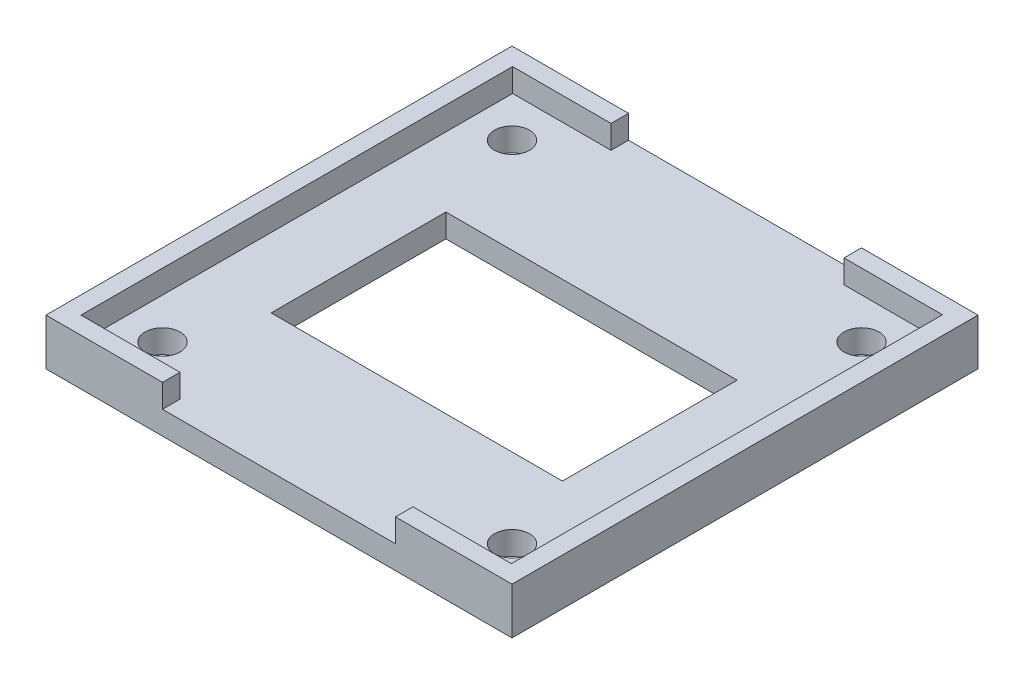
ISO-10303-21;
HEADER;
FILE_DESCRIPTION(('STEP AP214'),'2;1');
FILE_NAME('part.step','',(''),(''),'','','');
FILE_SCHEMA(('AUTOMOTIVE_DESIGN { 1 0 10303 214 1 1 1 1 }'));
ENDSEC;
DATA;
#1=APPLICATION_CONTEXT('core data for automotive mechanical design processes');
#2=APPLICATION_PROTOCOL_DEFINITION('international standard','automotive_design',2000,#1);
#3=PRODUCT_CONTEXT('',#1,'mechanical');
#4=PRODUCT('Part','Part','',(#3));
#5=PRODUCT_RELATED_PRODUCT_CATEGORY('part','',(#4));
#6=PRODUCT_DEFINITION_FORMATION('','',#4);
#7=PRODUCT_DEFINITION_CONTEXT('part definition',#1,'design');
#8=PRODUCT_DEFINITION('design','',#6,#7);
#9=PRODUCT_DEFINITION_SHAPE('','',#8);
#10=(LENGTH_UNIT() NAMED_UNIT(*) SI_UNIT(.MILLI.,.METRE.));
#11=(NAMED_UNIT(*) PLANE_ANGLE_UNIT() SI_UNIT($,.RADIAN.));
#12=(NAMED_UNIT(*) SI_UNIT($,.STERADIAN.) SOLID_ANGLE_UNIT());
#13=UNCERTAINTY_MEASURE_WITH_UNIT(LENGTH_MEASURE(1.E-05),#10,'distance_accuracy_value','');
#14=(GEOMETRIC_REPRESENTATION_CONTEXT(3) GLOBAL_UNCERTAINTY_ASSIGNED_CONTEXT((#13)) GLOBAL_UNIT_ASSIGNED_CONTEXT((#10,
#11,#12)) REPRESENTATION_CONTEXT('',''));
#15=CARTESIAN_POINT('',(0.,0.,0.));
#16=DIRECTION('',(0.,0.,1.));
#17=DIRECTION('',(1.,0.,0.));
#18=AXIS2_PLACEMENT_3D('',#15,#16,#17);
#19=CARTESIAN_POINT('',(0.,2.,0.));
#20=DIRECTION('',(0.,1.,0.));
#21=DIRECTION('',(0.,0.,1.));
#22=AXIS2_PLACEMENT_3D('',#19,#20,#21);
#23=PLANE('',#22);
#24=DIRECTION('',(0.,0.,1.));
#25=VECTOR('',#24,1.);
#26=CARTESIAN_POINT('',(12.5,2.,7.5));
#27=LINE('',#26,#25);
#28=CARTESIAN_POINT('',(12.5,2.,-7.5));
#29=VERTEX_POINT('',#28);
#30=CARTESIAN_POINT('',(12.5,2.,7.5));
#31=VERTEX_POINT('',#30);
#32=EDGE_CURVE('E172',#29,#31,#27,.T.);
#33=ORIENTED_EDGE('',*,*,#32,.T.);
#34=DIRECTION('',(-1.,0.,0.));
#35=VECTOR('',#34,1.);
#36=CARTESIAN_POINT('',(-12.5,2.,7.5));
#37=LINE('',#36,#35);
#38=CARTESIAN_POINT('',(-12.5,2.,7.5));
#39=VERTEX_POINT('',#38);
#40=EDGE_CURVE('E181',#31,#39,#37,.T.);
#41=ORIENTED_EDGE('',*,*,#40,.T.);
#42=DIRECTION('',(0.,0.,-1.));
#43=VECTOR('',#42,1.);
#44=CARTESIAN_POINT('',(-12.5,2.,7.5));
#45=LINE('',#44,#43);
#46=CARTESIAN_POINT('',(-12.5,2.,-7.5));
#47=VERTEX_POINT('',#46);
#48=EDGE_CURVE('E48',#39,#47,#45,.T.);
#49=ORIENTED_EDGE('',*,*,#48,.T.);
#50=DIRECTION('',(1.,0.,0.));
#51=VECTOR('',#50,1.);
#52=CARTESIAN_POINT('',(-12.5,2.,-7.5));
#53=LINE('',#52,#51);
#54=EDGE_CURVE('E178',#47,#29,#53,.T.);
#55=ORIENTED_EDGE('',*,*,#54,.T.);
#56=EDGE_LOOP('',(#33,#41,#49,#55));
#57=FACE_BOUND('',#56,.T.);
#58=CARTESIAN_POINT('',(15.,2.,14.3258426966292));
#59=DIRECTION('',(0.,1.,0.));
#60=DIRECTION('',(0.,0.,-1.));
#61=AXIS2_PLACEMENT_3D('',#58,#59,#60);
#62=CIRCLE('',#61,1.5);
#63=CARTESIAN_POINT('',(15.,2.,12.8258426966292));
#64=VERTEX_POINT('',#63);
#65=EDGE_CURVE('E316',#64,#64,#62,.T.);
#66=ORIENTED_EDGE('',*,*,#65,.F.);
#67=EDGE_LOOP('',(#66));
#68=FACE_BOUND('',#67,.T.);
#69=CARTESIAN_POINT('',(-15.,2.,-15.6741573033708));
#70=DIRECTION('',(0.,1.,0.));
#71=DIRECTION('',(0.,0.,1.));
#72=AXIS2_PLACEMENT_3D('',#69,#70,#71);
#73=CIRCLE('',#72,1.5);
#74=CARTESIAN_POINT('',(-15.,2.,-14.1741573033708));
#75=VERTEX_POINT('',#74);
#76=EDGE_CURVE('E328',#75,#75,#73,.T.);
#77=ORIENTED_EDGE('',*,*,#76,.F.);
#78=EDGE_LOOP('',(#77));
#79=FACE_BOUND('',#78,.T.);
#80=CARTESIAN_POINT('',(15.,2.,-15.6741573033708));
#81=DIRECTION('',(0.,1.,0.));
#82=DIRECTION('',(0.,0.,1.));
#83=AXIS2_PLACEMENT_3D('',#80,#81,#82);
#84=CIRCLE('',#83,1.5);
#85=CARTESIAN_POINT('',(15.,2.,-14.1741573033708));
#86=VERTEX_POINT('',#85);
#87=EDGE_CURVE('E322',#86,#86,#84,.T.);
#88=ORIENTED_EDGE('',*,*,#87,.F.);
#89=EDGE_LOOP('',(#88));
#90=FACE_BOUND('',#89,.T.);
#91=CARTESIAN_POINT('',(-15.,2.,14.3258426966292));
#92=DIRECTION('',(0.,1.,0.));
#93=DIRECTION('',(0.,0.,-1.));
#94=AXIS2_PLACEMENT_3D('',#91,#92,#93);
#95=CIRCLE('',#94,1.5);
#96=CARTESIAN_POINT('',(-15.,2.,12.8258426966292));
#97=VERTEX_POINT('',#96);
#98=EDGE_CURVE('E310',#97,#97,#95,.T.);
#99=ORIENTED_EDGE('',*,*,#98,.F.);
#100=EDGE_LOOP('',(#99));
#101=FACE_BOUND('',#100,.T.);
#102=DIRECTION('',(1.,0.,0.));
#103=VECTOR('',#102,1.);
#104=CARTESIAN_POINT('',(-20.,2.,19.3258426966292));
#105=LINE('',#104,#103);
#106=CARTESIAN_POINT('',(-10.0000000000003,2.,19.3258426966292));
#107=VERTEX_POINT('',#106);
#108=CARTESIAN_POINT('',(10.0000000000002,2.,19.3258426966292));
#109=VERTEX_POINT('',#108);
#110=EDGE_CURVE('E336',#107,#109,#105,.T.);
#111=ORIENTED_EDGE('',*,*,#110,.T.);
#112=DIRECTION('',(0.,0.,1.));
#113=VECTOR('',#112,1.);
#114=CARTESIAN_POINT('',(10.0000000000002,2.,19.3258426966292));
#115=LINE('',#114,#113);
#116=CARTESIAN_POINT('',(10.0000000000003,2.,17.8258426966292));
#117=VERTEX_POINT('',#116);
#118=EDGE_CURVE('E232',#117,#109,#115,.T.);
#119=ORIENTED_EDGE('',*,*,#118,.F.);
#120=DIRECTION('',(-1.,0.,0.));
#121=VECTOR('',#120,1.);
#122=CARTESIAN_POINT('',(10.0000000000003,2.,17.8258426966292));
#123=LINE('',#122,#121);
#124=CARTESIAN_POINT('',(18.4476744186047,2.,17.8258426966292));
#125=VERTEX_POINT('',#124);
#126=EDGE_CURVE('E229',#125,#117,#123,.T.);
#127=ORIENTED_EDGE('',*,*,#126,.F.);
#128=DIRECTION('',(0.,0.,1.));
#129=VECTOR('',#128,1.);
#130=CARTESIAN_POINT('',(18.4476744186047,2.,17.8258426966292));
#131=LINE('',#130,#129);
#132=CARTESIAN_POINT('',(18.4476744186047,2.,-19.1741573033708));
#133=VERTEX_POINT('',#132);
#134=EDGE_CURVE('E202',#133,#125,#131,.T.);
#135=ORIENTED_EDGE('',*,*,#134,.F.);
#136=DIRECTION('',(1.,0.,0.));
#137=VECTOR('',#136,1.);
#138=CARTESIAN_POINT('',(18.4476744186047,2.,-19.1741573033708));
#139=LINE('',#138,#137);
#140=CARTESIAN_POINT('',(10.0000000000002,2.,-19.1741573033708));
#141=VERTEX_POINT('',#140);
#142=EDGE_CURVE('E210',#141,#133,#139,.T.);
#143=ORIENTED_EDGE('',*,*,#142,.F.);
#144=DIRECTION('',(0.,0.,1.));
#145=VECTOR('',#144,1.);
#146=CARTESIAN_POINT('',(10.0000000000002,2.,-19.1741573033708));
#147=LINE('',#146,#145);
#148=CARTESIAN_POINT('',(10.0000000000002,2.,-20.6741573033708));
#149=VERTEX_POINT('',#148);
#150=EDGE_CURVE('E235',#149,#141,#147,.T.);
#151=ORIENTED_EDGE('',*,*,#150,.F.);
#152=DIRECTION('',(-1.,0.,0.));
#153=VECTOR('',#152,1.);
#154=CARTESIAN_POINT('',(-20.,2.,-20.6741573033708));
#155=LINE('',#154,#153);
#156=CARTESIAN_POINT('',(-10.0000000000002,2.,-20.6741573033708));
#157=VERTEX_POINT('',#156);
#158=EDGE_CURVE('E334',#149,#157,#155,.T.);
#159=ORIENTED_EDGE('',*,*,#158,.T.);
#160=DIRECTION('',(0.,0.,-1.));
#161=VECTOR('',#160,1.);
#162=CARTESIAN_POINT('',(-10.0000000000002,2.,-19.1741573033708));
#163=LINE('',#162,#161);
#164=CARTESIAN_POINT('',(-10.0000000000002,2.,-19.1741573033708));
#165=VERTEX_POINT('',#164);
#166=EDGE_CURVE('E281',#165,#157,#163,.T.);
#167=ORIENTED_EDGE('',*,*,#166,.F.);
#168=DIRECTION('',(1.,0.,0.));
#169=VECTOR('',#168,1.);
#170=CARTESIAN_POINT('',(-18.4476744186047,2.,-19.1741573033708));
#171=LINE('',#170,#169);
#172=CARTESIAN_POINT('',(-18.4476744186047,2.,-19.1741573033708));
#173=VERTEX_POINT('',#172);
#174=EDGE_CURVE('E257',#173,#165,#171,.T.);
#175=ORIENTED_EDGE('',*,*,#174,.F.);
#176=DIRECTION('',(0.00140803916500905,0.,-0.999999008712364));
#177=VECTOR('',#176,1.);
#178=CARTESIAN_POINT('',(-18.4476744186047,2.,-19.1741573033708));
#179=LINE('',#178,#177);
#180=CARTESIAN_POINT('',(-18.4997719193536,2.,17.8258426966292));
#181=VERTEX_POINT('',#180);
#182=EDGE_CURVE('E262',#181,#173,#179,.T.);
#183=ORIENTED_EDGE('',*,*,#182,.F.);
#184=DIRECTION('',(-1.,0.,0.));
#185=VECTOR('',#184,1.);
#186=CARTESIAN_POINT('',(-18.4997719193536,2.,17.8258426966292));
#187=LINE('',#186,#185);
#188=CARTESIAN_POINT('',(-10.0000000000003,2.,17.8258426966292));
#189=VERTEX_POINT('',#188);
#190=EDGE_CURVE('E287',#189,#181,#187,.T.);
#191=ORIENTED_EDGE('',*,*,#190,.F.);
#192=DIRECTION('',(0.,0.,-1.));
#193=VECTOR('',#192,1.);
#194=CARTESIAN_POINT('',(-10.0000000000002,2.,19.3258426966292));
#195=LINE('',#194,#193);
#196=EDGE_CURVE('E284',#107,#189,#195,.T.);
#197=ORIENTED_EDGE('',*,*,#196,.F.);
#198=EDGE_LOOP('',(#111,#119,#127,#135,#143,#151,#159,#167,#175,#183,#191,#197));
#199=FACE_BOUND('',#198,.T.);
#200=ADVANCED_FACE('F33',(#57,#68,#79,#90,#101,#199),#23,.T.);
#201=CARTESIAN_POINT('',(0.,0.,0.));
#202=DIRECTION('',(0.,1.,0.));
#203=DIRECTION('',(0.,0.,1.));
#204=AXIS2_PLACEMENT_3D('',#201,#202,#203);
#205=PLANE('',#204);
#206=DIRECTION('',(-1.,0.,0.));
#207=VECTOR('',#206,1.);
#208=CARTESIAN_POINT('',(-12.5,0.,7.5));
#209=LINE('',#208,#207);
#210=CARTESIAN_POINT('',(12.5,0.,7.5));
#211=VERTEX_POINT('',#210);
#212=CARTESIAN_POINT('',(-12.5,0.,7.5));
#213=VERTEX_POINT('',#212);
#214=EDGE_CURVE('E196',#211,#213,#209,.T.);
#215=ORIENTED_EDGE('',*,*,#214,.F.);
#216=DIRECTION('',(0.,0.,1.));
#217=VECTOR('',#216,1.);
#218=CARTESIAN_POINT('',(12.5,0.,7.5));
#219=LINE('',#218,#217);
#220=CARTESIAN_POINT('',(12.5,0.,-7.5));
#221=VERTEX_POINT('',#220);
#222=EDGE_CURVE('E56',#221,#211,#219,.T.);
#223=ORIENTED_EDGE('',*,*,#222,.F.);
#224=DIRECTION('',(1.,0.,0.));
#225=VECTOR('',#224,1.);
#226=CARTESIAN_POINT('',(-12.5,0.,-7.5));
#227=LINE('',#226,#225);
#228=CARTESIAN_POINT('',(-12.5,0.,-7.5));
#229=VERTEX_POINT('',#228);
#230=EDGE_CURVE('E187',#229,#221,#227,.T.);
#231=ORIENTED_EDGE('',*,*,#230,.F.);
#232=DIRECTION('',(0.,0.,-1.));
#233=VECTOR('',#232,1.);
#234=CARTESIAN_POINT('',(-12.5,0.,7.5));
#235=LINE('',#234,#233);
#236=EDGE_CURVE('E190',#213,#229,#235,.T.);
#237=ORIENTED_EDGE('',*,*,#236,.F.);
#238=EDGE_LOOP('',(#215,#223,#231,#237));
#239=FACE_BOUND('',#238,.T.);
#240=DIRECTION('',(0.,0.,-1.));
#241=VECTOR('',#240,1.);
#242=CARTESIAN_POINT('',(20.,0.,-20.6741573033708));
#243=LINE('',#242,#241);
#244=CARTESIAN_POINT('',(20.,0.,19.3258426966292));
#245=VERTEX_POINT('',#244);
#246=CARTESIAN_POINT('',(20.,0.,-20.6741573033708));
#247=VERTEX_POINT('',#246);
#248=EDGE_CURVE('E331',#245,#247,#243,.T.);
#249=ORIENTED_EDGE('',*,*,#248,.F.);
#250=DIRECTION('',(1.,0.,0.));
#251=VECTOR('',#250,1.);
#252=CARTESIAN_POINT('',(-20.,0.,19.3258426966292));
#253=LINE('',#252,#251);
#254=CARTESIAN_POINT('',(-20.,0.,19.3258426966292));
#255=VERTEX_POINT('',#254);
#256=EDGE_CURVE('E337',#255,#245,#253,.T.);
#257=ORIENTED_EDGE('',*,*,#256,.F.);
#258=DIRECTION('',(0.,0.,1.));
#259=VECTOR('',#258,1.);
#260=CARTESIAN_POINT('',(-20.,0.,-20.6741573033708));
#261=LINE('',#260,#259);
#262=CARTESIAN_POINT('',(-20.,0.,-20.6741573033708));
#263=VERTEX_POINT('',#262);
#264=EDGE_CURVE('E344',#263,#255,#261,.T.);
#265=ORIENTED_EDGE('',*,*,#264,.F.);
#266=DIRECTION('',(-1.,0.,0.));
#267=VECTOR('',#266,1.);
#268=CARTESIAN_POINT('',(-20.,0.,-20.6741573033708));
#269=LINE('',#268,#267);
#270=EDGE_CURVE('E342',#247,#263,#269,.T.);
#271=ORIENTED_EDGE('',*,*,#270,.F.);
#272=EDGE_LOOP('',(#249,#257,#265,#271));
#273=FACE_BOUND('',#272,.T.);
#274=CARTESIAN_POINT('',(-15.,0.,-15.6741573033708));
#275=DIRECTION('',(0.,1.,0.));
#276=DIRECTION('',(0.,0.,1.));
#277=AXIS2_PLACEMENT_3D('',#274,#275,#276);
#278=CIRCLE('',#277,1.5);
#279=CARTESIAN_POINT('',(-15.,0.,-14.1741573033708));
#280=VERTEX_POINT('',#279);
#281=EDGE_CURVE('E325',#280,#280,#278,.T.);
#282=ORIENTED_EDGE('',*,*,#281,.T.);
#283=EDGE_LOOP('',(#282));
#284=FACE_BOUND('',#283,.T.);
#285=CARTESIAN_POINT('',(15.,0.,-15.6741573033708));
#286=DIRECTION('',(0.,1.,0.));
#287=DIRECTION('',(0.,0.,1.));
#288=AXIS2_PLACEMENT_3D('',#285,#286,#287);
#289=CIRCLE('',#288,1.5);
#290=CARTESIAN_POINT('',(15.,0.,-14.1741573033708));
#291=VERTEX_POINT('',#290);
#292=EDGE_CURVE('E319',#291,#291,#289,.T.);
#293=ORIENTED_EDGE('',*,*,#292,.T.);
#294=EDGE_LOOP('',(#293));
#295=FACE_BOUND('',#294,.T.);
#296=CARTESIAN_POINT('',(15.,0.,14.3258426966292));
#297=DIRECTION('',(0.,1.,0.));
#298=DIRECTION('',(0.,0.,-1.));
#299=AXIS2_PLACEMENT_3D('',#296,#297,#298);
#300=CIRCLE('',#299,1.5);
#301=CARTESIAN_POINT('',(15.,0.,12.8258426966292));
#302=VERTEX_POINT('',#301);
#303=EDGE_CURVE('E313',#302,#302,#300,.T.);
#304=ORIENTED_EDGE('',*,*,#303,.T.);
#305=EDGE_LOOP('',(#304));
#306=FACE_BOUND('',#305,.T.);
#307=CARTESIAN_POINT('',(-15.,0.,14.3258426966292));
#308=DIRECTION('',(0.,1.,0.));
#309=DIRECTION('',(0.,0.,-1.));
#310=AXIS2_PLACEMENT_3D('',#307,#308,#309);
#311=CIRCLE('',#310,1.5);
#312=CARTESIAN_POINT('',(-15.,0.,12.8258426966292));
#313=VERTEX_POINT('',#312);
#314=EDGE_CURVE('E309',#313,#313,#311,.T.);
#315=ORIENTED_EDGE('',*,*,#314,.T.);
#316=EDGE_LOOP('',(#315));
#317=FACE_BOUND('',#316,.T.);
#318=ADVANCED_FACE('F361',(#239,#273,#284,#295,#306,#317),#205,.F.);
#319=CARTESIAN_POINT('',(20.,2.,-20.6741573033708));
#320=DIRECTION('',(-1.,0.,0.));
#321=DIRECTION('',(0.,0.,1.));
#322=AXIS2_PLACEMENT_3D('',#319,#320,#321);
#323=PLANE('',#322);
#324=ORIENTED_EDGE('',*,*,#248,.T.);
#325=DIRECTION('',(0.,-1.,0.));
#326=VECTOR('',#325,1.);
#327=CARTESIAN_POINT('',(20.,2.,-20.6741573033708));
#328=LINE('',#327,#326);
#329=CARTESIAN_POINT('',(20.,4.,-20.6741573033708));
#330=VERTEX_POINT('',#329);
#331=EDGE_CURVE('E11',#330,#247,#328,.T.);
#332=ORIENTED_EDGE('',*,*,#331,.F.);
#333=DIRECTION('',(0.,0.,-1.));
#334=VECTOR('',#333,1.);
#335=CARTESIAN_POINT('',(20.,4.,-20.6741573033708));
#336=LINE('',#335,#334);
#337=CARTESIAN_POINT('',(20.,4.,19.3258426966292));
#338=VERTEX_POINT('',#337);
#339=EDGE_CURVE('E217',#338,#330,#336,.T.);
#340=ORIENTED_EDGE('',*,*,#339,.F.);
#341=DIRECTION('',(0.,-1.,0.));
#342=VECTOR('',#341,1.);
#343=CARTESIAN_POINT('',(20.,2.,19.3258426966292));
#344=LINE('',#343,#342);
#345=EDGE_CURVE('E339',#338,#245,#344,.T.);
#346=ORIENTED_EDGE('',*,*,#345,.T.);
#347=EDGE_LOOP('',(#324,#332,#340,#346));
#348=FACE_BOUND('',#347,.T.);
#349=ADVANCED_FACE('F35',(#348),#323,.F.);
#350=CARTESIAN_POINT('',(-20.,2.,-20.6741573033708));
#351=DIRECTION('',(0.,0.,1.));
#352=DIRECTION('',(1.,0.,0.));
#353=AXIS2_PLACEMENT_3D('',#350,#351,#352);
#354=PLANE('',#353);
#355=ORIENTED_EDGE('',*,*,#270,.T.);
#356=DIRECTION('',(0.,-1.,0.));
#357=VECTOR('',#356,1.);
#358=CARTESIAN_POINT('',(-20.,2.,-20.6741573033708));
#359=LINE('',#358,#357);
#360=CARTESIAN_POINT('',(-20.,4.,-20.6741573033708));
#361=VERTEX_POINT('',#360);
#362=EDGE_CURVE('E41',#361,#263,#359,.T.);
#363=ORIENTED_EDGE('',*,*,#362,.F.);
#364=DIRECTION('',(-1.,0.,0.));
#365=VECTOR('',#364,1.);
#366=CARTESIAN_POINT('',(-10.0000000000002,4.,-20.6741573033708));
#367=LINE('',#366,#365);
#368=CARTESIAN_POINT('',(-10.0000000000002,4.,-20.6741573033708));
#369=VERTEX_POINT('',#368);
#370=EDGE_CURVE('E264',#369,#361,#367,.T.);
#371=ORIENTED_EDGE('',*,*,#370,.F.);
#372=DIRECTION('',(0.,-1.,0.));
#373=VECTOR('',#372,1.);
#374=CARTESIAN_POINT('',(-10.0000000000002,4.,-20.6741573033708));
#375=LINE('',#374,#373);
#376=EDGE_CURVE('E303',#369,#157,#375,.T.);
#377=ORIENTED_EDGE('',*,*,#376,.T.);
#378=ORIENTED_EDGE('',*,*,#158,.F.);
#379=DIRECTION('',(0.,-1.,0.));
#380=VECTOR('',#379,1.);
#381=CARTESIAN_POINT('',(10.0000000000002,4.,-20.6741573033708));
#382=LINE('',#381,#380);
#383=CARTESIAN_POINT('',(10.0000000000002,4.,-20.6741573033708));
#384=VERTEX_POINT('',#383);
#385=EDGE_CURVE('E245',#384,#149,#382,.T.);
#386=ORIENTED_EDGE('',*,*,#385,.F.);
#387=DIRECTION('',(-1.,0.,0.));
#388=VECTOR('',#387,1.);
#389=CARTESIAN_POINT('',(10.0000000000002,4.,-20.6741573033708));
#390=LINE('',#389,#388);
#391=EDGE_CURVE('E220',#330,#384,#390,.T.);
#392=ORIENTED_EDGE('',*,*,#391,.F.);
#393=ORIENTED_EDGE('',*,*,#331,.T.);
#394=EDGE_LOOP('',(#355,#363,#371,#377,#378,#386,#392,#393));
#395=FACE_BOUND('',#394,.T.);
#396=ADVANCED_FACE('F373',(#395),#354,.F.);
#397=CARTESIAN_POINT('',(-20.,2.,-20.6741573033708));
#398=DIRECTION('',(1.,0.,0.));
#399=DIRECTION('',(0.,0.,-1.));
#400=AXIS2_PLACEMENT_3D('',#397,#398,#399);
#401=PLANE('',#400);
#402=ORIENTED_EDGE('',*,*,#264,.T.);
#403=DIRECTION('',(0.,-1.,0.));
#404=VECTOR('',#403,1.);
#405=CARTESIAN_POINT('',(-20.,2.,19.3258426966292));
#406=LINE('',#405,#404);
#407=CARTESIAN_POINT('',(-20.,4.,19.3258426966292));
#408=VERTEX_POINT('',#407);
#409=EDGE_CURVE('E349',#408,#255,#406,.T.);
#410=ORIENTED_EDGE('',*,*,#409,.F.);
#411=DIRECTION('',(0.,0.,1.));
#412=VECTOR('',#411,1.);
#413=CARTESIAN_POINT('',(-20.,4.,-20.6741573033708));
#414=LINE('',#413,#412);
#415=EDGE_CURVE('E267',#361,#408,#414,.T.);
#416=ORIENTED_EDGE('',*,*,#415,.F.);
#417=ORIENTED_EDGE('',*,*,#362,.T.);
#418=EDGE_LOOP('',(#402,#410,#416,#417));
#419=FACE_BOUND('',#418,.T.);
#420=ADVANCED_FACE('F355',(#419),#401,.F.);
#421=CARTESIAN_POINT('',(-20.,2.,19.3258426966292));
#422=DIRECTION('',(0.,0.,-1.));
#423=DIRECTION('',(-1.,0.,0.));
#424=AXIS2_PLACEMENT_3D('',#421,#422,#423);
#425=PLANE('',#424);
#426=ORIENTED_EDGE('',*,*,#256,.T.);
#427=ORIENTED_EDGE('',*,*,#345,.F.);
#428=DIRECTION('',(1.,0.,0.));
#429=VECTOR('',#428,1.);
#430=CARTESIAN_POINT('',(20.,4.,19.3258426966292));
#431=LINE('',#430,#429);
#432=CARTESIAN_POINT('',(10.0000000000002,4.,19.3258426966292));
#433=VERTEX_POINT('',#432);
#434=EDGE_CURVE('E214',#433,#338,#431,.T.);
#435=ORIENTED_EDGE('',*,*,#434,.F.);
#436=DIRECTION('',(0.,-1.,0.));
#437=VECTOR('',#436,1.);
#438=CARTESIAN_POINT('',(10.0000000000002,4.,19.3258426966292));
#439=LINE('',#438,#437);
#440=EDGE_CURVE('E248',#433,#109,#439,.T.);
#441=ORIENTED_EDGE('',*,*,#440,.T.);
#442=ORIENTED_EDGE('',*,*,#110,.F.);
#443=DIRECTION('',(0.,-1.,0.));
#444=VECTOR('',#443,1.);
#445=CARTESIAN_POINT('',(-10.0000000000002,4.,19.3258426966292));
#446=LINE('',#445,#444);
#447=CARTESIAN_POINT('',(-10.0000000000002,4.,19.3258426966292));
#448=VERTEX_POINT('',#447);
#449=EDGE_CURVE('E300',#448,#107,#446,.T.);
#450=ORIENTED_EDGE('',*,*,#449,.F.);
#451=DIRECTION('',(1.,0.,0.));
#452=VECTOR('',#451,1.);
#453=CARTESIAN_POINT('',(-20.,4.,19.3258426966292));
#454=LINE('',#453,#452);
#455=EDGE_CURVE('E270',#408,#448,#454,.T.);
#456=ORIENTED_EDGE('',*,*,#455,.F.);
#457=ORIENTED_EDGE('',*,*,#409,.T.);
#458=EDGE_LOOP('',(#426,#427,#435,#441,#442,#450,#456,#457));
#459=FACE_BOUND('',#458,.T.);
#460=ADVANCED_FACE('F364',(#459),#425,.F.);
#461=CARTESIAN_POINT('',(-15.,2.,-15.6741573033708));
#462=DIRECTION('',(0.,-1.,0.));
#463=DIRECTION('',(0.,0.,-1.));
#464=AXIS2_PLACEMENT_3D('',#461,#462,#463);
#465=CYLINDRICAL_SURFACE('',#464,1.5);
#466=ORIENTED_EDGE('',*,*,#76,.T.);
#467=EDGE_LOOP('',(#466));
#468=FACE_BOUND('',#467,.T.);
#469=ORIENTED_EDGE('',*,*,#281,.F.);
#470=EDGE_LOOP('',(#469));
#471=FACE_BOUND('',#470,.T.);
#472=ADVANCED_FACE('F435',(#468,#471),#465,.F.);
#473=CARTESIAN_POINT('',(15.,2.,-15.6741573033708));
#474=DIRECTION('',(0.,-1.,0.));
#475=DIRECTION('',(0.,0.,-1.));
#476=AXIS2_PLACEMENT_3D('',#473,#474,#475);
#477=CYLINDRICAL_SURFACE('',#476,1.5);
#478=ORIENTED_EDGE('',*,*,#87,.T.);
#479=EDGE_LOOP('',(#478));
#480=FACE_BOUND('',#479,.T.);
#481=ORIENTED_EDGE('',*,*,#292,.F.);
#482=EDGE_LOOP('',(#481));
#483=FACE_BOUND('',#482,.T.);
#484=ADVANCED_FACE('F633',(#480,#483),#477,.F.);
#485=CARTESIAN_POINT('',(15.,2.,14.3258426966292));
#486=DIRECTION('',(0.,-1.,0.));
#487=DIRECTION('',(0.,0.,-1.));
#488=AXIS2_PLACEMENT_3D('',#485,#486,#487);
#489=CYLINDRICAL_SURFACE('',#488,1.5);
#490=ORIENTED_EDGE('',*,*,#65,.T.);
#491=EDGE_LOOP('',(#490));
#492=FACE_BOUND('',#491,.T.);
#493=ORIENTED_EDGE('',*,*,#303,.F.);
#494=EDGE_LOOP('',(#493));
#495=FACE_BOUND('',#494,.T.);
#496=ADVANCED_FACE('F424',(#492,#495),#489,.F.);
#497=CARTESIAN_POINT('',(-15.,2.,14.3258426966292));
#498=DIRECTION('',(0.,-1.,0.));
#499=DIRECTION('',(0.,0.,-1.));
#500=AXIS2_PLACEMENT_3D('',#497,#498,#499);
#501=CYLINDRICAL_SURFACE('',#500,1.5);
#502=ORIENTED_EDGE('',*,*,#98,.T.);
#503=EDGE_LOOP('',(#502));
#504=FACE_BOUND('',#503,.T.);
#505=ORIENTED_EDGE('',*,*,#314,.F.);
#506=EDGE_LOOP('',(#505));
#507=FACE_BOUND('',#506,.T.);
#508=ADVANCED_FACE('F417',(#504,#507),#501,.F.);
#509=CARTESIAN_POINT('',(-18.4476744186047,4.,-19.1741573033708));
#510=DIRECTION('',(0.,0.,-1.));
#511=DIRECTION('',(-1.,0.,0.));
#512=AXIS2_PLACEMENT_3D('',#509,#510,#511);
#513=PLANE('',#512);
#514=ORIENTED_EDGE('',*,*,#174,.T.);
#515=DIRECTION('',(0.,-1.,0.));
#516=VECTOR('',#515,1.);
#517=CARTESIAN_POINT('',(-10.0000000000002,4.,-19.1741573033708));
#518=LINE('',#517,#516);
#519=CARTESIAN_POINT('',(-10.0000000000002,4.,-19.1741573033708));
#520=VERTEX_POINT('',#519);
#521=EDGE_CURVE('E306',#520,#165,#518,.T.);
#522=ORIENTED_EDGE('',*,*,#521,.F.);
#523=DIRECTION('',(1.,0.,0.));
#524=VECTOR('',#523,1.);
#525=CARTESIAN_POINT('',(-18.4476744186047,4.,-19.1741573033708));
#526=LINE('',#525,#524);
#527=CARTESIAN_POINT('',(-18.4476744186047,4.,-19.1741573033708));
#528=VERTEX_POINT('',#527);
#529=EDGE_CURVE('E258',#528,#520,#526,.T.);
#530=ORIENTED_EDGE('',*,*,#529,.F.);
#531=DIRECTION('',(0.,-1.,0.));
#532=VECTOR('',#531,1.);
#533=CARTESIAN_POINT('',(-18.4476744186047,4.,-19.1741573033708));
#534=LINE('',#533,#532);
#535=EDGE_CURVE('E278',#528,#173,#534,.T.);
#536=ORIENTED_EDGE('',*,*,#535,.T.);
#537=EDGE_LOOP('',(#514,#522,#530,#536));
#538=FACE_BOUND('',#537,.T.);
#539=ADVANCED_FACE('F415',(#538),#513,.F.);
#540=CARTESIAN_POINT('',(-10.0000000000002,4.,-19.1741573033708));
#541=DIRECTION('',(-1.,0.,0.));
#542=DIRECTION('',(0.,0.,1.));
#543=AXIS2_PLACEMENT_3D('',#540,#541,#542);
#544=PLANE('',#543);
#545=ORIENTED_EDGE('',*,*,#166,.T.);
#546=ORIENTED_EDGE('',*,*,#376,.F.);
#547=DIRECTION('',(0.,0.,-1.));
#548=VECTOR('',#547,1.);
#549=CARTESIAN_POINT('',(-10.0000000000002,4.,-19.1741573033708));
#550=LINE('',#549,#548);
#551=EDGE_CURVE('E261',#520,#369,#550,.T.);
#552=ORIENTED_EDGE('',*,*,#551,.F.);
#553=ORIENTED_EDGE('',*,*,#521,.T.);
#554=EDGE_LOOP('',(#545,#546,#552,#553));
#555=FACE_BOUND('',#554,.T.);
#556=ADVANCED_FACE('F407',(#555),#544,.F.);
#557=CARTESIAN_POINT('',(-10.0000000000002,4.,19.3258426966292));
#558=DIRECTION('',(-1.,0.,0.));
#559=DIRECTION('',(0.,0.,1.));
#560=AXIS2_PLACEMENT_3D('',#557,#558,#559);
#561=PLANE('',#560);
#562=ORIENTED_EDGE('',*,*,#196,.T.);
#563=DIRECTION('',(0.,-1.,0.));
#564=VECTOR('',#563,1.);
#565=CARTESIAN_POINT('',(-10.0000000000003,4.,17.8258426966292));
#566=LINE('',#565,#564);
#567=CARTESIAN_POINT('',(-10.0000000000003,4.,17.8258426966292));
#568=VERTEX_POINT('',#567);
#569=EDGE_CURVE('E297',#568,#189,#566,.T.);
#570=ORIENTED_EDGE('',*,*,#569,.F.);
#571=DIRECTION('',(0.,0.,-1.));
#572=VECTOR('',#571,1.);
#573=CARTESIAN_POINT('',(-10.0000000000002,4.,19.3258426966292));
#574=LINE('',#573,#572);
#575=EDGE_CURVE('E272',#448,#568,#574,.T.);
#576=ORIENTED_EDGE('',*,*,#575,.F.);
#577=ORIENTED_EDGE('',*,*,#449,.T.);
#578=EDGE_LOOP('',(#562,#570,#576,#577));
#579=FACE_BOUND('',#578,.T.);
#580=ADVANCED_FACE('F399',(#579),#561,.F.);
#581=CARTESIAN_POINT('',(-18.4997719193536,4.,17.8258426966292));
#582=DIRECTION('',(0.,0.,1.));
#583=DIRECTION('',(1.,0.,0.));
#584=AXIS2_PLACEMENT_3D('',#581,#582,#583);
#585=PLANE('',#584);
#586=ORIENTED_EDGE('',*,*,#190,.T.);
#587=DIRECTION('',(0.,-1.,0.));
#588=VECTOR('',#587,1.);
#589=CARTESIAN_POINT('',(-18.4997719193536,4.,17.8258426966292));
#590=LINE('',#589,#588);
#591=CARTESIAN_POINT('',(-18.4997719193536,4.,17.8258426966292));
#592=VERTEX_POINT('',#591);
#593=EDGE_CURVE('E294',#592,#181,#590,.T.);
#594=ORIENTED_EDGE('',*,*,#593,.F.);
#595=DIRECTION('',(-1.,0.,0.));
#596=VECTOR('',#595,1.);
#597=CARTESIAN_POINT('',(-10.0000000000003,4.,17.8258426966292));
#598=LINE('',#597,#596);
#599=EDGE_CURVE('E274',#568,#592,#598,.T.);
#600=ORIENTED_EDGE('',*,*,#599,.F.);
#601=ORIENTED_EDGE('',*,*,#569,.T.);
#602=EDGE_LOOP('',(#586,#594,#600,#601));
#603=FACE_BOUND('',#602,.T.);
#604=ADVANCED_FACE('F513',(#603),#585,.F.);
#605=CARTESIAN_POINT('',(-18.4476744186047,4.,-19.1741573033708));
#606=DIRECTION('',(-0.999999008712364,0.,-0.00140803916500905));
#607=DIRECTION('',(-0.00140803916500905,0.,0.999999008712364));
#608=AXIS2_PLACEMENT_3D('',#605,#606,#607);
#609=PLANE('',#608);
#610=ORIENTED_EDGE('',*,*,#182,.T.);
#611=ORIENTED_EDGE('',*,*,#535,.F.);
#612=DIRECTION('',(0.00140803916500905,0.,-0.999999008712364));
#613=VECTOR('',#612,1.);
#614=CARTESIAN_POINT('',(-18.4476744186047,4.,-19.1741573033708));
#615=LINE('',#614,#613);
#616=EDGE_CURVE('E276',#592,#528,#615,.T.);
#617=ORIENTED_EDGE('',*,*,#616,.F.);
#618=ORIENTED_EDGE('',*,*,#593,.T.);
#619=EDGE_LOOP('',(#610,#611,#617,#618));
#620=FACE_BOUND('',#619,.T.);
#621=ADVANCED_FACE('F412',(#620),#609,.F.);
#622=CARTESIAN_POINT('',(0.,4.,0.));
#623=DIRECTION('',(0.,1.,0.));
#624=DIRECTION('',(0.,0.,1.));
#625=AXIS2_PLACEMENT_3D('',#622,#623,#624);
#626=PLANE('',#625);
#627=ORIENTED_EDGE('',*,*,#529,.T.);
#628=ORIENTED_EDGE('',*,*,#551,.T.);
#629=ORIENTED_EDGE('',*,*,#370,.T.);
#630=ORIENTED_EDGE('',*,*,#415,.T.);
#631=ORIENTED_EDGE('',*,*,#455,.T.);
#632=ORIENTED_EDGE('',*,*,#575,.T.);
#633=ORIENTED_EDGE('',*,*,#599,.T.);
#634=ORIENTED_EDGE('',*,*,#616,.T.);
#635=EDGE_LOOP('',(#627,#628,#629,#630,#631,#632,#633,#634));
#636=FACE_BOUND('',#635,.T.);
#637=ADVANCED_FACE('F403',(#636),#626,.T.);
#638=CARTESIAN_POINT('',(18.4476744186047,4.,17.8258426966292));
#639=DIRECTION('',(1.,0.,0.));
#640=DIRECTION('',(0.,0.,-1.));
#641=AXIS2_PLACEMENT_3D('',#638,#639,#640);
#642=PLANE('',#641);
#643=ORIENTED_EDGE('',*,*,#134,.T.);
#644=DIRECTION('',(0.,-1.,0.));
#645=VECTOR('',#644,1.);
#646=CARTESIAN_POINT('',(18.4476744186047,4.,17.8258426966292));
#647=LINE('',#646,#645);
#648=CARTESIAN_POINT('',(18.4476744186047,4.,17.8258426966292));
#649=VERTEX_POINT('',#648);
#650=EDGE_CURVE('E254',#649,#125,#647,.T.);
#651=ORIENTED_EDGE('',*,*,#650,.F.);
#652=DIRECTION('',(0.,0.,1.));
#653=VECTOR('',#652,1.);
#654=CARTESIAN_POINT('',(18.4476744186047,4.,17.8258426966292));
#655=LINE('',#654,#653);
#656=CARTESIAN_POINT('',(18.4476744186047,4.,-19.1741573033708));
#657=VERTEX_POINT('',#656);
#658=EDGE_CURVE('E206',#657,#649,#655,.T.);
#659=ORIENTED_EDGE('',*,*,#658,.F.);
#660=DIRECTION('',(0.,-1.,0.));
#661=VECTOR('',#660,1.);
#662=CARTESIAN_POINT('',(18.4476744186047,4.,-19.1741573033708));
#663=LINE('',#662,#661);
#664=EDGE_CURVE('E226',#657,#133,#663,.T.);
#665=ORIENTED_EDGE('',*,*,#664,.T.);
#666=EDGE_LOOP('',(#643,#651,#659,#665));
#667=FACE_BOUND('',#666,.T.);
#668=ADVANCED_FACE('F386',(#667),#642,.F.);
#669=CARTESIAN_POINT('',(10.0000000000003,4.,17.8258426966292));
#670=DIRECTION('',(0.,0.,1.));
#671=DIRECTION('',(1.,0.,0.));
#672=AXIS2_PLACEMENT_3D('',#669,#670,#671);
#673=PLANE('',#672);
#674=ORIENTED_EDGE('',*,*,#126,.T.);
#675=DIRECTION('',(0.,-1.,0.));
#676=VECTOR('',#675,1.);
#677=CARTESIAN_POINT('',(10.0000000000003,4.,17.8258426966292));
#678=LINE('',#677,#676);
#679=CARTESIAN_POINT('',(10.0000000000003,4.,17.8258426966292));
#680=VERTEX_POINT('',#679);
#681=EDGE_CURVE('E251',#680,#117,#678,.T.);
#682=ORIENTED_EDGE('',*,*,#681,.F.);
#683=DIRECTION('',(-1.,0.,0.));
#684=VECTOR('',#683,1.);
#685=CARTESIAN_POINT('',(10.0000000000003,4.,17.8258426966292));
#686=LINE('',#685,#684);
#687=EDGE_CURVE('E209',#649,#680,#686,.T.);
#688=ORIENTED_EDGE('',*,*,#687,.F.);
#689=ORIENTED_EDGE('',*,*,#650,.T.);
#690=EDGE_LOOP('',(#674,#682,#688,#689));
#691=FACE_BOUND('',#690,.T.);
#692=ADVANCED_FACE('F388',(#691),#673,.F.);
#693=CARTESIAN_POINT('',(10.0000000000002,4.,19.3258426966292));
#694=DIRECTION('',(1.,0.,0.));
#695=DIRECTION('',(0.,0.,-1.));
#696=AXIS2_PLACEMENT_3D('',#693,#694,#695);
#697=PLANE('',#696);
#698=ORIENTED_EDGE('',*,*,#118,.T.);
#699=ORIENTED_EDGE('',*,*,#440,.F.);
#700=DIRECTION('',(0.,0.,1.));
#701=VECTOR('',#700,1.);
#702=CARTESIAN_POINT('',(10.0000000000002,4.,19.3258426966292));
#703=LINE('',#702,#701);
#704=EDGE_CURVE('E212',#680,#433,#703,.T.);
#705=ORIENTED_EDGE('',*,*,#704,.F.);
#706=ORIENTED_EDGE('',*,*,#681,.T.);
#707=EDGE_LOOP('',(#698,#699,#705,#706));
#708=FACE_BOUND('',#707,.T.);
#709=ADVANCED_FACE('F393',(#708),#697,.F.);
#710=CARTESIAN_POINT('',(10.0000000000002,4.,-19.1741573033708));
#711=DIRECTION('',(1.,0.,0.));
#712=DIRECTION('',(0.,0.,-1.));
#713=AXIS2_PLACEMENT_3D('',#710,#711,#712);
#714=PLANE('',#713);
#715=ORIENTED_EDGE('',*,*,#150,.T.);
#716=DIRECTION('',(0.,-1.,0.));
#717=VECTOR('',#716,1.);
#718=CARTESIAN_POINT('',(10.0000000000002,4.,-19.1741573033708));
#719=LINE('',#718,#717);
#720=CARTESIAN_POINT('',(10.0000000000002,4.,-19.1741573033708));
#721=VERTEX_POINT('',#720);
#722=EDGE_CURVE('E242',#721,#141,#719,.T.);
#723=ORIENTED_EDGE('',*,*,#722,.F.);
#724=DIRECTION('',(0.,0.,1.));
#725=VECTOR('',#724,1.);
#726=CARTESIAN_POINT('',(10.0000000000002,4.,-19.1741573033708));
#727=LINE('',#726,#725);
#728=EDGE_CURVE('E222',#384,#721,#727,.T.);
#729=ORIENTED_EDGE('',*,*,#728,.F.);
#730=ORIENTED_EDGE('',*,*,#385,.T.);
#731=EDGE_LOOP('',(#715,#723,#729,#730));
#732=FACE_BOUND('',#731,.T.);
#733=ADVANCED_FACE('F378',(#732),#714,.F.);
#734=CARTESIAN_POINT('',(18.4476744186047,4.,-19.1741573033708));
#735=DIRECTION('',(0.,0.,-1.));
#736=DIRECTION('',(-1.,0.,0.));
#737=AXIS2_PLACEMENT_3D('',#734,#735,#736);
#738=PLANE('',#737);
#739=ORIENTED_EDGE('',*,*,#142,.T.);
#740=ORIENTED_EDGE('',*,*,#664,.F.);
#741=DIRECTION('',(1.,0.,0.));
#742=VECTOR('',#741,1.);
#743=CARTESIAN_POINT('',(18.4476744186047,4.,-19.1741573033708));
#744=LINE('',#743,#742);
#745=EDGE_CURVE('E224',#721,#657,#744,.T.);
#746=ORIENTED_EDGE('',*,*,#745,.F.);
#747=ORIENTED_EDGE('',*,*,#722,.T.);
#748=EDGE_LOOP('',(#739,#740,#746,#747));
#749=FACE_BOUND('',#748,.T.);
#750=ADVANCED_FACE('F384',(#749),#738,.F.);
#751=CARTESIAN_POINT('',(0.,4.,0.));
#752=DIRECTION('',(0.,1.,0.));
#753=DIRECTION('',(0.,0.,1.));
#754=AXIS2_PLACEMENT_3D('',#751,#752,#753);
#755=PLANE('',#754);
#756=ORIENTED_EDGE('',*,*,#658,.T.);
#757=ORIENTED_EDGE('',*,*,#687,.T.);
#758=ORIENTED_EDGE('',*,*,#704,.T.);
#759=ORIENTED_EDGE('',*,*,#434,.T.);
#760=ORIENTED_EDGE('',*,*,#339,.T.);
#761=ORIENTED_EDGE('',*,*,#391,.T.);
#762=ORIENTED_EDGE('',*,*,#728,.T.);
#763=ORIENTED_EDGE('',*,*,#745,.T.);
#764=EDGE_LOOP('',(#756,#757,#758,#759,#760,#761,#762,#763));
#765=FACE_BOUND('',#764,.T.);
#766=ADVANCED_FACE('F371',(#765),#755,.T.);
#767=CARTESIAN_POINT('',(12.5,2.,7.5));
#768=DIRECTION('',(1.,0.,0.));
#769=DIRECTION('',(0.,0.,-1.));
#770=AXIS2_PLACEMENT_3D('',#767,#768,#769);
#771=PLANE('',#770);
#772=ORIENTED_EDGE('',*,*,#222,.T.);
#773=DIRECTION('',(0.,-1.,0.));
#774=VECTOR('',#773,1.);
#775=CARTESIAN_POINT('',(12.5,2.,7.5));
#776=LINE('',#775,#774);
#777=EDGE_CURVE('E168',#31,#211,#776,.T.);
#778=ORIENTED_EDGE('',*,*,#777,.F.);
#779=ORIENTED_EDGE('',*,*,#32,.F.);
#780=DIRECTION('',(0.,-1.,0.));
#781=VECTOR('',#780,1.);
#782=CARTESIAN_POINT('',(12.5,2.,-7.5));
#783=LINE('',#782,#781);
#784=EDGE_CURVE('E200',#29,#221,#783,.T.);
#785=ORIENTED_EDGE('',*,*,#784,.T.);
#786=EDGE_LOOP('',(#772,#778,#779,#785));
#787=FACE_BOUND('',#786,.T.);
#788=ADVANCED_FACE('F170',(#787),#771,.F.);
#789=CARTESIAN_POINT('',(-12.5,2.,-7.5));
#790=DIRECTION('',(0.,0.,-1.));
#791=DIRECTION('',(-1.,0.,0.));
#792=AXIS2_PLACEMENT_3D('',#789,#790,#791);
#793=PLANE('',#792);
#794=ORIENTED_EDGE('',*,*,#230,.T.);
#795=ORIENTED_EDGE('',*,*,#784,.F.);
#796=ORIENTED_EDGE('',*,*,#54,.F.);
#797=DIRECTION('',(0.,-1.,0.));
#798=VECTOR('',#797,1.);
#799=CARTESIAN_POINT('',(-12.5,2.,-7.5));
#800=LINE('',#799,#798);
#801=EDGE_CURVE('E203',#47,#229,#800,.T.);
#802=ORIENTED_EDGE('',*,*,#801,.T.);
#803=EDGE_LOOP('',(#794,#795,#796,#802));
#804=FACE_BOUND('',#803,.T.);
#805=ADVANCED_FACE('F465',(#804),#793,.F.);
#806=CARTESIAN_POINT('',(-12.5,2.,7.5));
#807=DIRECTION('',(-1.,0.,0.));
#808=DIRECTION('',(0.,0.,1.));
#809=AXIS2_PLACEMENT_3D('',#806,#807,#808);
#810=PLANE('',#809);
#811=ORIENTED_EDGE('',*,*,#236,.T.);
#812=ORIENTED_EDGE('',*,*,#801,.F.);
#813=ORIENTED_EDGE('',*,*,#48,.F.);
#814=DIRECTION('',(0.,-1.,0.));
#815=VECTOR('',#814,1.);
#816=CARTESIAN_POINT('',(-12.5,2.,7.5));
#817=LINE('',#816,#815);
#818=EDGE_CURVE('E177',#39,#213,#817,.T.);
#819=ORIENTED_EDGE('',*,*,#818,.T.);
#820=EDGE_LOOP('',(#811,#812,#813,#819));
#821=FACE_BOUND('',#820,.T.);
#822=ADVANCED_FACE('F476',(#821),#810,.F.);
#823=CARTESIAN_POINT('',(-12.5,2.,7.5));
#824=DIRECTION('',(0.,0.,1.));
#825=DIRECTION('',(1.,0.,0.));
#826=AXIS2_PLACEMENT_3D('',#823,#824,#825);
#827=PLANE('',#826);
#828=ORIENTED_EDGE('',*,*,#214,.T.);
#829=ORIENTED_EDGE('',*,*,#818,.F.);
#830=ORIENTED_EDGE('',*,*,#40,.F.);
#831=ORIENTED_EDGE('',*,*,#777,.T.);
#832=EDGE_LOOP('',(#828,#829,#830,#831));
#833=FACE_BOUND('',#832,.T.);
#834=ADVANCED_FACE('F182',(#833),#827,.F.);
#835=CLOSED_SHELL('',(#200,#318,#349,#396,#420,#460,#472,#484,#496,#508,#539,#556,#580,#604,
#621,#637,#668,#692,#709,#733,#750,#766,#788,#805,#822,#834));
#836=MANIFOLD_SOLID_BREP('B2',#835);
#837=ADVANCED_BREP_SHAPE_REPRESENTATION('',(#18,#836),#14);
#838=SHAPE_DEFINITION_REPRESENTATION(#9,#837);
ENDSEC;
END-ISO-10303-21;
